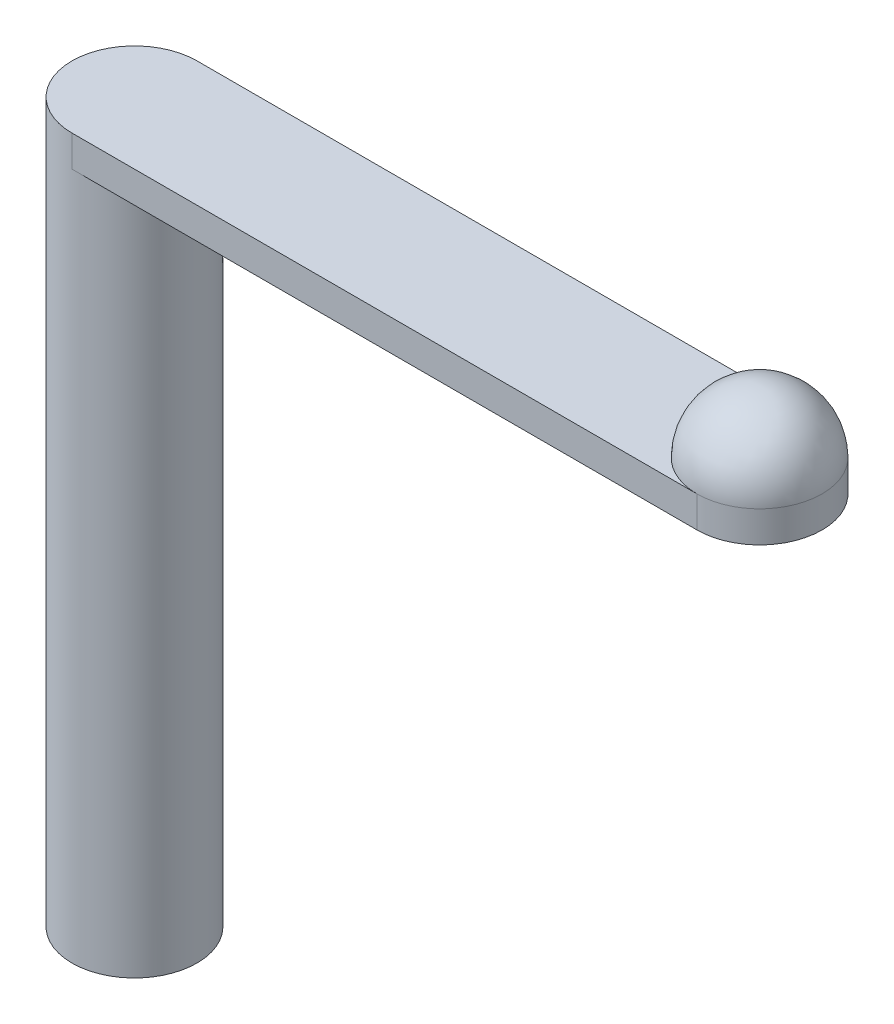
ISO-10303-21;
HEADER;
FILE_DESCRIPTION(('STEP AP214'),'2;1');
FILE_NAME('part.step','',(''),(''),'','','');
FILE_SCHEMA(('AUTOMOTIVE_DESIGN { 1 0 10303 214 1 1 1 1 }'));
ENDSEC;
DATA;
#1=APPLICATION_CONTEXT('core data for automotive mechanical design processes');
#2=APPLICATION_PROTOCOL_DEFINITION('international standard','automotive_design',2000,#1);
#3=PRODUCT_CONTEXT('',#1,'mechanical');
#4=PRODUCT('Part','Part','',(#3));
#5=PRODUCT_RELATED_PRODUCT_CATEGORY('part','',(#4));
#6=PRODUCT_DEFINITION_FORMATION('','',#4);
#7=PRODUCT_DEFINITION_CONTEXT('part definition',#1,'design');
#8=PRODUCT_DEFINITION('design','',#6,#7);
#9=PRODUCT_DEFINITION_SHAPE('','',#8);
#10=(LENGTH_UNIT() NAMED_UNIT(*) SI_UNIT(.MILLI.,.METRE.));
#11=(NAMED_UNIT(*) PLANE_ANGLE_UNIT() SI_UNIT($,.RADIAN.));
#12=(NAMED_UNIT(*) SI_UNIT($,.STERADIAN.) SOLID_ANGLE_UNIT());
#13=UNCERTAINTY_MEASURE_WITH_UNIT(LENGTH_MEASURE(1.E-05),#10,'distance_accuracy_value','');
#14=(GEOMETRIC_REPRESENTATION_CONTEXT(3) GLOBAL_UNCERTAINTY_ASSIGNED_CONTEXT((#13)) GLOBAL_UNIT_ASSIGNED_CONTEXT((#10,
#11,#12)) REPRESENTATION_CONTEXT('',''));
#15=CARTESIAN_POINT('',(0.,0.,0.));
#16=DIRECTION('',(0.,0.,1.));
#17=DIRECTION('',(1.,0.,0.));
#18=AXIS2_PLACEMENT_3D('',#15,#16,#17);
#19=CARTESIAN_POINT('',(0.,110.,0.));
#20=DIRECTION('',(0.,-1.,0.));
#21=DIRECTION('',(0.,0.,-1.));
#22=AXIS2_PLACEMENT_3D('',#19,#20,#21);
#23=CYLINDRICAL_SURFACE('',#22,10.);
#24=CARTESIAN_POINT('',(0.,110.,0.));
#25=DIRECTION('',(0.,1.,0.));
#26=DIRECTION('',(0.,0.,1.));
#27=AXIS2_PLACEMENT_3D('',#24,#25,#26);
#28=CIRCLE('',#27,10.);
#29=CARTESIAN_POINT('',(0.,110.,10.));
#30=VERTEX_POINT('',#29);
#31=CARTESIAN_POINT('',(0.,110.,-10.));
#32=VERTEX_POINT('',#31);
#33=EDGE_CURVE('E47',#30,#32,#28,.T.);
#34=ORIENTED_EDGE('',*,*,#33,.F.);
#35=DIRECTION('',(0.,-1.,0.));
#36=VECTOR('',#35,1.);
#37=CARTESIAN_POINT('',(0.,115.,10.));
#38=LINE('',#37,#36);
#39=CARTESIAN_POINT('',(0.,115.,10.));
#40=VERTEX_POINT('',#39);
#41=EDGE_CURVE('E86',#40,#30,#38,.T.);
#42=ORIENTED_EDGE('',*,*,#41,.F.);
#43=CARTESIAN_POINT('',(0.,115.,0.));
#44=DIRECTION('',(0.,1.,0.));
#45=DIRECTION('',(0.,0.,1.));
#46=AXIS2_PLACEMENT_3D('',#43,#44,#45);
#47=CIRCLE('',#46,10.);
#48=CARTESIAN_POINT('',(0.,115.,-10.));
#49=VERTEX_POINT('',#48);
#50=EDGE_CURVE('E91',#49,#40,#47,.T.);
#51=ORIENTED_EDGE('',*,*,#50,.F.);
#52=DIRECTION('',(0.,-1.,0.));
#53=VECTOR('',#52,1.);
#54=CARTESIAN_POINT('',(0.,115.,-10.));
#55=LINE('',#54,#53);
#56=EDGE_CURVE('E102',#49,#32,#55,.T.);
#57=ORIENTED_EDGE('',*,*,#56,.T.);
#58=EDGE_LOOP('',(#34,#42,#51,#57));
#59=FACE_BOUND('',#58,.T.);
#60=CARTESIAN_POINT('',(0.,0.,0.));
#61=DIRECTION('',(0.,1.,0.));
#62=DIRECTION('',(0.,0.,1.));
#63=AXIS2_PLACEMENT_3D('',#60,#61,#62);
#64=CIRCLE('',#63,10.);
#65=CARTESIAN_POINT('',(0.,0.,10.));
#66=VERTEX_POINT('',#65);
#67=EDGE_CURVE('E96',#66,#66,#64,.T.);
#68=ORIENTED_EDGE('',*,*,#67,.T.);
#69=EDGE_LOOP('',(#68));
#70=FACE_BOUND('',#69,.T.);
#71=ADVANCED_FACE('F32',(#59,#70),#23,.T.);
#72=CARTESIAN_POINT('',(0.,0.,0.));
#73=DIRECTION('',(0.,1.,0.));
#74=DIRECTION('',(0.,0.,1.));
#75=AXIS2_PLACEMENT_3D('',#72,#73,#74);
#76=PLANE('',#75);
#77=ORIENTED_EDGE('',*,*,#67,.F.);
#78=EDGE_LOOP('',(#77));
#79=FACE_BOUND('',#78,.T.);
#80=ADVANCED_FACE('F113',(#79),#76,.F.);
#81=CARTESIAN_POINT('',(0.,110.,0.));
#82=DIRECTION('',(0.,1.,0.));
#83=DIRECTION('',(0.,0.,1.));
#84=AXIS2_PLACEMENT_3D('',#81,#82,#83);
#85=PLANE('',#84);
#86=DIRECTION('',(1.,0.,0.));
#87=VECTOR('',#86,1.);
#88=CARTESIAN_POINT('',(0.,110.,10.));
#89=LINE('',#88,#87);
#90=CARTESIAN_POINT('',(100.,110.,10.));
#91=VERTEX_POINT('',#90);
#92=EDGE_CURVE('E84',#30,#91,#89,.T.);
#93=ORIENTED_EDGE('',*,*,#92,.F.);
#94=ORIENTED_EDGE('',*,*,#33,.T.);
#95=DIRECTION('',(-1.,0.,0.));
#96=VECTOR('',#95,1.);
#97=CARTESIAN_POINT('',(0.,110.,-10.));
#98=LINE('',#97,#96);
#99=CARTESIAN_POINT('',(100.,110.,-10.));
#100=VERTEX_POINT('',#99);
#101=EDGE_CURVE('E99',#100,#32,#98,.T.);
#102=ORIENTED_EDGE('',*,*,#101,.F.);
#103=CARTESIAN_POINT('',(100.,110.,0.));
#104=DIRECTION('',(0.,1.,0.));
#105=DIRECTION('',(0.,0.,-1.));
#106=AXIS2_PLACEMENT_3D('',#103,#104,#105);
#107=CIRCLE('',#106,10.);
#108=EDGE_CURVE('E73',#91,#100,#107,.T.);
#109=ORIENTED_EDGE('',*,*,#108,.F.);
#110=EDGE_LOOP('',(#93,#94,#102,#109));
#111=FACE_BOUND('',#110,.T.);
#112=ADVANCED_FACE('F115',(#111),#85,.F.);
#113=CARTESIAN_POINT('',(0.,115.,10.));
#114=DIRECTION('',(0.,0.,-1.));
#115=DIRECTION('',(-1.,0.,0.));
#116=AXIS2_PLACEMENT_3D('',#113,#114,#115);
#117=PLANE('',#116);
#118=ORIENTED_EDGE('',*,*,#92,.T.);
#119=DIRECTION('',(0.,-1.,0.));
#120=VECTOR('',#119,1.);
#121=CARTESIAN_POINT('',(100.,115.,10.));
#122=LINE('',#121,#120);
#123=CARTESIAN_POINT('',(100.,115.,10.));
#124=VERTEX_POINT('',#123);
#125=EDGE_CURVE('E82',#124,#91,#122,.T.);
#126=ORIENTED_EDGE('',*,*,#125,.F.);
#127=DIRECTION('',(1.,0.,0.));
#128=VECTOR('',#127,1.);
#129=CARTESIAN_POINT('',(0.,115.,10.));
#130=LINE('',#129,#128);
#131=EDGE_CURVE('E80',#40,#124,#130,.T.);
#132=ORIENTED_EDGE('',*,*,#131,.F.);
#133=ORIENTED_EDGE('',*,*,#41,.T.);
#134=EDGE_LOOP('',(#118,#126,#132,#133));
#135=FACE_BOUND('',#134,.T.);
#136=ADVANCED_FACE('F83',(#135),#117,.F.);
#137=CARTESIAN_POINT('',(100.,115.,0.));
#138=DIRECTION('',(0.,-1.,0.));
#139=DIRECTION('',(0.,0.,-1.));
#140=AXIS2_PLACEMENT_3D('',#137,#138,#139);
#141=CYLINDRICAL_SURFACE('',#140,10.);
#142=CARTESIAN_POINT('',(100.,115.001,0.));
#143=DIRECTION('',(0.,-1.,0.));
#144=DIRECTION('',(0.,0.,-1.));
#145=AXIS2_PLACEMENT_3D('',#142,#143,#144);
#146=CIRCLE('',#145,10.);
#147=CARTESIAN_POINT('',(100.,115.001,-10.));
#148=VERTEX_POINT('',#147);
#149=EDGE_CURVE('E11',#148,#148,#146,.T.);
#150=ORIENTED_EDGE('',*,*,#149,.T.);
#151=EDGE_LOOP('',(#150));
#152=FACE_BOUND('',#151,.T.);
#153=ORIENTED_EDGE('',*,*,#108,.T.);
#154=DIRECTION('',(0.,-1.,0.));
#155=VECTOR('',#154,1.);
#156=CARTESIAN_POINT('',(100.,115.,-10.));
#157=LINE('',#156,#155);
#158=CARTESIAN_POINT('',(100.,115.,-10.));
#159=VERTEX_POINT('',#158);
#160=EDGE_CURVE('E87',#159,#100,#157,.T.);
#161=ORIENTED_EDGE('',*,*,#160,.F.);
#162=CARTESIAN_POINT('',(100.,115.,0.));
#163=DIRECTION('',(0.,1.,0.));
#164=DIRECTION('',(0.,0.,1.));
#165=AXIS2_PLACEMENT_3D('',#162,#163,#164);
#166=CIRCLE('',#165,10.);
#167=EDGE_CURVE('E40',#159,#124,#166,.T.);
#168=ORIENTED_EDGE('',*,*,#167,.T.);
#169=ORIENTED_EDGE('',*,*,#125,.T.);
#170=EDGE_LOOP('',(#153,#161,#168,#169));
#171=FACE_BOUND('',#170,.T.);
#172=ADVANCED_FACE('F94',(#152,#171),#141,.T.);
#173=CARTESIAN_POINT('',(0.,115.,-10.));
#174=DIRECTION('',(0.,0.,1.));
#175=DIRECTION('',(1.,0.,0.));
#176=AXIS2_PLACEMENT_3D('',#173,#174,#175);
#177=PLANE('',#176);
#178=ORIENTED_EDGE('',*,*,#101,.T.);
#179=ORIENTED_EDGE('',*,*,#56,.F.);
#180=DIRECTION('',(-1.,0.,0.));
#181=VECTOR('',#180,1.);
#182=CARTESIAN_POINT('',(0.,115.,-10.));
#183=LINE('',#182,#181);
#184=EDGE_CURVE('E56',#159,#49,#183,.T.);
#185=ORIENTED_EDGE('',*,*,#184,.F.);
#186=ORIENTED_EDGE('',*,*,#160,.T.);
#187=EDGE_LOOP('',(#178,#179,#185,#186));
#188=FACE_BOUND('',#187,.T.);
#189=ADVANCED_FACE('F128',(#188),#177,.F.);
#190=CARTESIAN_POINT('',(0.,115.,0.));
#191=DIRECTION('',(0.,1.,0.));
#192=DIRECTION('',(0.,0.,1.));
#193=AXIS2_PLACEMENT_3D('',#190,#191,#192);
#194=PLANE('',#193);
#195=ORIENTED_EDGE('',*,*,#167,.F.);
#196=ORIENTED_EDGE('',*,*,#184,.T.);
#197=ORIENTED_EDGE('',*,*,#50,.T.);
#198=ORIENTED_EDGE('',*,*,#131,.T.);
#199=EDGE_LOOP('',(#195,#196,#197,#198));
#200=FACE_BOUND('',#199,.T.);
#201=ADVANCED_FACE('F89',(#200),#194,.T.);
#202=CARTESIAN_POINT('',(100.,115.001,0.));
#203=DIRECTION('',(0.,1.,0.));
#204=DIRECTION('',(0.,0.,1.));
#205=AXIS2_PLACEMENT_3D('',#202,#203,#204);
#206=SPHERICAL_SURFACE('',#205,10.);
#207=ORIENTED_EDGE('',*,*,#149,.F.);
#208=EDGE_LOOP('',(#207));
#209=FACE_BOUND('',#208,.T.);
#210=ADVANCED_FACE('F34',(#209),#206,.T.);
#211=CLOSED_SHELL('',(#71,#80,#112,#136,#172,#189,#201,#210));
#212=MANIFOLD_SOLID_BREP('B2',#211);
#213=ADVANCED_BREP_SHAPE_REPRESENTATION('',(#18,#212),#14);
#214=SHAPE_DEFINITION_REPRESENTATION(#9,#213);
ENDSEC;
END-ISO-10303-21;
